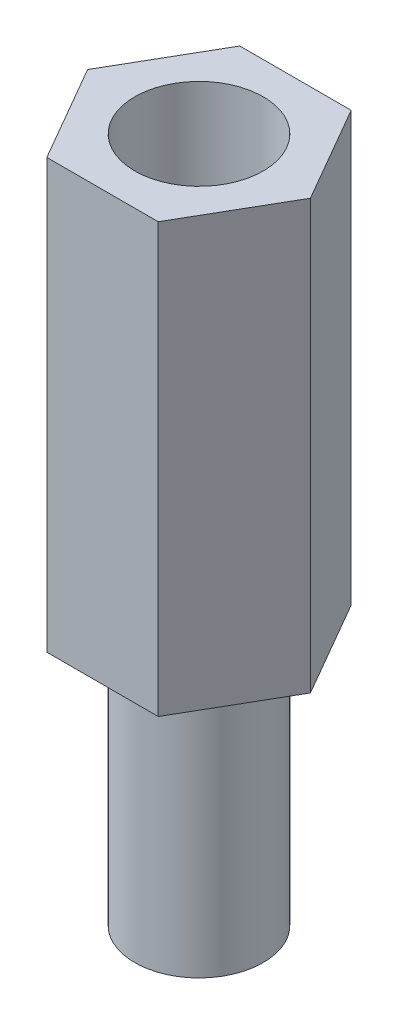
ISO-10303-21;
HEADER;
FILE_DESCRIPTION(('STEP AP214'),'2;1');
FILE_NAME('part.step','',(''),(''),'','','');
FILE_SCHEMA(('AUTOMOTIVE_DESIGN { 1 0 10303 214 1 1 1 1 }'));
ENDSEC;
DATA;
#1=APPLICATION_CONTEXT('core data for automotive mechanical design processes');
#2=APPLICATION_PROTOCOL_DEFINITION('international standard','automotive_design',2000,#1);
#3=PRODUCT_CONTEXT('',#1,'mechanical');
#4=PRODUCT('Part','Part','',(#3));
#5=PRODUCT_RELATED_PRODUCT_CATEGORY('part','',(#4));
#6=PRODUCT_DEFINITION_FORMATION('','',#4);
#7=PRODUCT_DEFINITION_CONTEXT('part definition',#1,'design');
#8=PRODUCT_DEFINITION('design','',#6,#7);
#9=PRODUCT_DEFINITION_SHAPE('','',#8);
#10=(LENGTH_UNIT() NAMED_UNIT(*) SI_UNIT(.MILLI.,.METRE.));
#11=(NAMED_UNIT(*) PLANE_ANGLE_UNIT() SI_UNIT($,.RADIAN.));
#12=(NAMED_UNIT(*) SI_UNIT($,.STERADIAN.) SOLID_ANGLE_UNIT());
#13=UNCERTAINTY_MEASURE_WITH_UNIT(LENGTH_MEASURE(1.E-05),#10,'distance_accuracy_value','');
#14=(GEOMETRIC_REPRESENTATION_CONTEXT(3) GLOBAL_UNCERTAINTY_ASSIGNED_CONTEXT((#13)) GLOBAL_UNIT_ASSIGNED_CONTEXT((#10,
#11,#12)) REPRESENTATION_CONTEXT('',''));
#15=CARTESIAN_POINT('',(0.,0.,0.));
#16=DIRECTION('',(0.,0.,1.));
#17=DIRECTION('',(1.,0.,0.));
#18=AXIS2_PLACEMENT_3D('',#15,#16,#17);
#19=CARTESIAN_POINT('',(1.3,10.,2.25166604983954));
#20=DIRECTION('',(-0.866025403784439,0.,-0.5));
#21=DIRECTION('',(-0.5,0.,0.866025403784439));
#22=AXIS2_PLACEMENT_3D('',#19,#20,#21);
#23=PLANE('',#22);
#24=DIRECTION('',(0.5,0.,-0.866025403784439));
#25=VECTOR('',#24,1.);
#26=CARTESIAN_POINT('',(1.3,0.,2.25166604983954));
#27=LINE('',#26,#25);
#28=CARTESIAN_POINT('',(1.3,0.,2.25166604983954));
#29=VERTEX_POINT('',#28);
#30=CARTESIAN_POINT('',(2.6,0.,0.));
#31=VERTEX_POINT('',#30);
#32=EDGE_CURVE('E131',#29,#31,#27,.T.);
#33=ORIENTED_EDGE('',*,*,#32,.T.);
#34=DIRECTION('',(0.,-1.,0.));
#35=VECTOR('',#34,1.);
#36=CARTESIAN_POINT('',(2.6,10.,0.));
#37=LINE('',#36,#35);
#38=CARTESIAN_POINT('',(2.6,10.,0.));
#39=VERTEX_POINT('',#38);
#40=EDGE_CURVE('E48',#39,#31,#37,.T.);
#41=ORIENTED_EDGE('',*,*,#40,.F.);
#42=DIRECTION('',(0.5,0.,-0.866025403784439));
#43=VECTOR('',#42,1.);
#44=CARTESIAN_POINT('',(1.3,10.,2.25166604983954));
#45=LINE('',#44,#43);
#46=CARTESIAN_POINT('',(1.3,10.,2.25166604983954));
#47=VERTEX_POINT('',#46);
#48=EDGE_CURVE('E142',#47,#39,#45,.T.);
#49=ORIENTED_EDGE('',*,*,#48,.F.);
#50=DIRECTION('',(0.,-1.,0.));
#51=VECTOR('',#50,1.);
#52=CARTESIAN_POINT('',(1.3,10.,2.25166604983954));
#53=LINE('',#52,#51);
#54=EDGE_CURVE('E127',#47,#29,#53,.T.);
#55=ORIENTED_EDGE('',*,*,#54,.T.);
#56=EDGE_LOOP('',(#33,#41,#49,#55));
#57=FACE_BOUND('',#56,.T.);
#58=ADVANCED_FACE('F45',(#57),#23,.F.);
#59=CARTESIAN_POINT('',(2.6,10.,0.));
#60=DIRECTION('',(-0.866025403784439,0.,0.5));
#61=DIRECTION('',(0.5,0.,0.866025403784439));
#62=AXIS2_PLACEMENT_3D('',#59,#60,#61);
#63=PLANE('',#62);
#64=DIRECTION('',(-0.5,0.,-0.866025403784439));
#65=VECTOR('',#64,1.);
#66=CARTESIAN_POINT('',(2.6,0.,0.));
#67=LINE('',#66,#65);
#68=CARTESIAN_POINT('',(1.3,0.,-2.25166604983954));
#69=VERTEX_POINT('',#68);
#70=EDGE_CURVE('E134',#31,#69,#67,.T.);
#71=ORIENTED_EDGE('',*,*,#70,.T.);
#72=DIRECTION('',(0.,-1.,0.));
#73=VECTOR('',#72,1.);
#74=CARTESIAN_POINT('',(1.3,10.,-2.25166604983954));
#75=LINE('',#74,#73);
#76=CARTESIAN_POINT('',(1.3,10.,-2.25166604983954));
#77=VERTEX_POINT('',#76);
#78=EDGE_CURVE('E145',#77,#69,#75,.T.);
#79=ORIENTED_EDGE('',*,*,#78,.F.);
#80=DIRECTION('',(-0.5,0.,-0.866025403784439));
#81=VECTOR('',#80,1.);
#82=CARTESIAN_POINT('',(2.6,10.,0.));
#83=LINE('',#82,#81);
#84=EDGE_CURVE('E100',#39,#77,#83,.T.);
#85=ORIENTED_EDGE('',*,*,#84,.F.);
#86=ORIENTED_EDGE('',*,*,#40,.T.);
#87=EDGE_LOOP('',(#71,#79,#85,#86));
#88=FACE_BOUND('',#87,.T.);
#89=ADVANCED_FACE('F150',(#88),#63,.F.);
#90=CARTESIAN_POINT('',(1.3,10.,-2.25166604983954));
#91=DIRECTION('',(0.,0.,1.));
#92=DIRECTION('',(1.,0.,0.));
#93=AXIS2_PLACEMENT_3D('',#90,#91,#92);
#94=PLANE('',#93);
#95=DIRECTION('',(-1.,0.,0.));
#96=VECTOR('',#95,1.);
#97=CARTESIAN_POINT('',(1.3,0.,-2.25166604983954));
#98=LINE('',#97,#96);
#99=CARTESIAN_POINT('',(-1.3,0.,-2.25166604983954));
#100=VERTEX_POINT('',#99);
#101=EDGE_CURVE('E137',#69,#100,#98,.T.);
#102=ORIENTED_EDGE('',*,*,#101,.T.);
#103=DIRECTION('',(0.,-1.,0.));
#104=VECTOR('',#103,1.);
#105=CARTESIAN_POINT('',(-1.3,10.,-2.25166604983954));
#106=LINE('',#105,#104);
#107=CARTESIAN_POINT('',(-1.3,10.,-2.25166604983954));
#108=VERTEX_POINT('',#107);
#109=EDGE_CURVE('E122',#108,#100,#106,.T.);
#110=ORIENTED_EDGE('',*,*,#109,.F.);
#111=DIRECTION('',(-1.,0.,0.));
#112=VECTOR('',#111,1.);
#113=CARTESIAN_POINT('',(1.3,10.,-2.25166604983954));
#114=LINE('',#113,#112);
#115=EDGE_CURVE('E113',#77,#108,#114,.T.);
#116=ORIENTED_EDGE('',*,*,#115,.F.);
#117=ORIENTED_EDGE('',*,*,#78,.T.);
#118=EDGE_LOOP('',(#102,#110,#116,#117));
#119=FACE_BOUND('',#118,.T.);
#120=ADVANCED_FACE('F156',(#119),#94,.F.);
#121=CARTESIAN_POINT('',(-1.3,10.,-2.25166604983954));
#122=DIRECTION('',(0.866025403784439,0.,0.5));
#123=DIRECTION('',(0.5,0.,-0.866025403784439));
#124=AXIS2_PLACEMENT_3D('',#121,#122,#123);
#125=PLANE('',#124);
#126=DIRECTION('',(-0.5,0.,0.866025403784439));
#127=VECTOR('',#126,1.);
#128=CARTESIAN_POINT('',(-1.3,0.,-2.25166604983954));
#129=LINE('',#128,#127);
#130=CARTESIAN_POINT('',(-2.6,0.,0.));
#131=VERTEX_POINT('',#130);
#132=EDGE_CURVE('E121',#100,#131,#129,.T.);
#133=ORIENTED_EDGE('',*,*,#132,.T.);
#134=DIRECTION('',(0.,-1.,0.));
#135=VECTOR('',#134,1.);
#136=CARTESIAN_POINT('',(-2.6,10.,0.));
#137=LINE('',#136,#135);
#138=CARTESIAN_POINT('',(-2.6,10.,0.));
#139=VERTEX_POINT('',#138);
#140=EDGE_CURVE('E118',#139,#131,#137,.T.);
#141=ORIENTED_EDGE('',*,*,#140,.F.);
#142=DIRECTION('',(-0.5,0.,0.866025403784439));
#143=VECTOR('',#142,1.);
#144=CARTESIAN_POINT('',(-1.3,10.,-2.25166604983954));
#145=LINE('',#144,#143);
#146=EDGE_CURVE('E107',#108,#139,#145,.T.);
#147=ORIENTED_EDGE('',*,*,#146,.F.);
#148=ORIENTED_EDGE('',*,*,#109,.T.);
#149=EDGE_LOOP('',(#133,#141,#147,#148));
#150=FACE_BOUND('',#149,.T.);
#151=ADVANCED_FACE('F119',(#150),#125,.F.);
#152=CARTESIAN_POINT('',(-2.6,10.,0.));
#153=DIRECTION('',(0.866025403784439,0.,-0.5));
#154=DIRECTION('',(-0.5,0.,-0.866025403784439));
#155=AXIS2_PLACEMENT_3D('',#152,#153,#154);
#156=PLANE('',#155);
#157=DIRECTION('',(0.5,0.,0.866025403784439));
#158=VECTOR('',#157,1.);
#159=CARTESIAN_POINT('',(-2.6,0.,0.));
#160=LINE('',#159,#158);
#161=CARTESIAN_POINT('',(-1.3,0.,2.25166604983954));
#162=VERTEX_POINT('',#161);
#163=EDGE_CURVE('E85',#131,#162,#160,.T.);
#164=ORIENTED_EDGE('',*,*,#163,.T.);
#165=DIRECTION('',(0.,-1.,0.));
#166=VECTOR('',#165,1.);
#167=CARTESIAN_POINT('',(-1.3,10.,2.25166604983954));
#168=LINE('',#167,#166);
#169=CARTESIAN_POINT('',(-1.3,10.,2.25166604983954));
#170=VERTEX_POINT('',#169);
#171=EDGE_CURVE('E123',#170,#162,#168,.T.);
#172=ORIENTED_EDGE('',*,*,#171,.F.);
#173=DIRECTION('',(0.5,0.,0.866025403784439));
#174=VECTOR('',#173,1.);
#175=CARTESIAN_POINT('',(-2.6,10.,0.));
#176=LINE('',#175,#174);
#177=EDGE_CURVE('E111',#139,#170,#176,.T.);
#178=ORIENTED_EDGE('',*,*,#177,.F.);
#179=ORIENTED_EDGE('',*,*,#140,.T.);
#180=EDGE_LOOP('',(#164,#172,#178,#179));
#181=FACE_BOUND('',#180,.T.);
#182=ADVANCED_FACE('F125',(#181),#156,.F.);
#183=CARTESIAN_POINT('',(-1.3,10.,2.25166604983954));
#184=DIRECTION('',(0.,0.,-1.));
#185=DIRECTION('',(-1.,0.,0.));
#186=AXIS2_PLACEMENT_3D('',#183,#184,#185);
#187=PLANE('',#186);
#188=DIRECTION('',(1.,0.,0.));
#189=VECTOR('',#188,1.);
#190=CARTESIAN_POINT('',(-1.3,0.,2.25166604983954));
#191=LINE('',#190,#189);
#192=EDGE_CURVE('E91',#162,#29,#191,.T.);
#193=ORIENTED_EDGE('',*,*,#192,.T.);
#194=ORIENTED_EDGE('',*,*,#54,.F.);
#195=DIRECTION('',(1.,0.,0.));
#196=VECTOR('',#195,1.);
#197=CARTESIAN_POINT('',(-1.3,10.,2.25166604983954));
#198=LINE('',#197,#196);
#199=EDGE_CURVE('E62',#170,#47,#198,.T.);
#200=ORIENTED_EDGE('',*,*,#199,.F.);
#201=ORIENTED_EDGE('',*,*,#171,.T.);
#202=EDGE_LOOP('',(#193,#194,#200,#201));
#203=FACE_BOUND('',#202,.T.);
#204=ADVANCED_FACE('F188',(#203),#187,.F.);
#205=CARTESIAN_POINT('',(0.,10.,0.));
#206=DIRECTION('',(0.,1.,0.));
#207=DIRECTION('',(0.,0.,1.));
#208=AXIS2_PLACEMENT_3D('',#205,#206,#207);
#209=PLANE('',#208);
#210=CARTESIAN_POINT('',(0.,10.,0.));
#211=DIRECTION('',(0.,1.,0.));
#212=DIRECTION('',(0.,0.,1.));
#213=AXIS2_PLACEMENT_3D('',#210,#211,#212);
#214=CIRCLE('',#213,1.5);
#215=CARTESIAN_POINT('',(0.,10.,1.5));
#216=VERTEX_POINT('',#215);
#217=EDGE_CURVE('E160',#216,#216,#214,.T.);
#218=ORIENTED_EDGE('',*,*,#217,.F.);
#219=EDGE_LOOP('',(#218));
#220=FACE_BOUND('',#219,.T.);
#221=ORIENTED_EDGE('',*,*,#48,.T.);
#222=ORIENTED_EDGE('',*,*,#84,.T.);
#223=ORIENTED_EDGE('',*,*,#115,.T.);
#224=ORIENTED_EDGE('',*,*,#146,.T.);
#225=ORIENTED_EDGE('',*,*,#177,.T.);
#226=ORIENTED_EDGE('',*,*,#199,.T.);
#227=EDGE_LOOP('',(#221,#222,#223,#224,#225,#226));
#228=FACE_BOUND('',#227,.T.);
#229=ADVANCED_FACE('F109',(#220,#228),#209,.T.);
#230=CARTESIAN_POINT('',(0.,0.,0.));
#231=DIRECTION('',(0.,1.,0.));
#232=DIRECTION('',(0.,0.,1.));
#233=AXIS2_PLACEMENT_3D('',#230,#231,#232);
#234=PLANE('',#233);
#235=CARTESIAN_POINT('',(0.,0.,0.));
#236=DIRECTION('',(0.,-1.,0.));
#237=DIRECTION('',(0.,0.,-1.));
#238=AXIS2_PLACEMENT_3D('',#235,#236,#237);
#239=CIRCLE('',#238,1.5);
#240=CARTESIAN_POINT('',(0.,0.,-1.5));
#241=VERTEX_POINT('',#240);
#242=EDGE_CURVE('E11',#241,#241,#239,.T.);
#243=ORIENTED_EDGE('',*,*,#242,.F.);
#244=EDGE_LOOP('',(#243));
#245=FACE_BOUND('',#244,.T.);
#246=ORIENTED_EDGE('',*,*,#32,.F.);
#247=ORIENTED_EDGE('',*,*,#192,.F.);
#248=ORIENTED_EDGE('',*,*,#163,.F.);
#249=ORIENTED_EDGE('',*,*,#132,.F.);
#250=ORIENTED_EDGE('',*,*,#101,.F.);
#251=ORIENTED_EDGE('',*,*,#70,.F.);
#252=EDGE_LOOP('',(#246,#247,#248,#249,#250,#251));
#253=FACE_BOUND('',#252,.T.);
#254=ADVANCED_FACE('F155',(#245,#253),#234,.F.);
#255=CARTESIAN_POINT('',(0.,3.,0.));
#256=DIRECTION('',(0.,1.,0.));
#257=DIRECTION('',(0.,0.,1.));
#258=AXIS2_PLACEMENT_3D('',#255,#256,#257);
#259=CYLINDRICAL_SURFACE('',#258,1.5);
#260=CARTESIAN_POINT('',(0.,3.,0.));
#261=DIRECTION('',(0.,1.,0.));
#262=DIRECTION('',(0.,0.,1.));
#263=AXIS2_PLACEMENT_3D('',#260,#261,#262);
#264=CIRCLE('',#263,1.5);
#265=CARTESIAN_POINT('',(0.,3.,1.5));
#266=VERTEX_POINT('',#265);
#267=EDGE_CURVE('E135',#266,#266,#264,.T.);
#268=ORIENTED_EDGE('',*,*,#267,.F.);
#269=EDGE_LOOP('',(#268));
#270=FACE_BOUND('',#269,.T.);
#271=ORIENTED_EDGE('',*,*,#217,.T.);
#272=EDGE_LOOP('',(#271));
#273=FACE_BOUND('',#272,.T.);
#274=ADVANCED_FACE('F179',(#270,#273),#259,.F.);
#275=CARTESIAN_POINT('',(0.,3.,0.));
#276=DIRECTION('',(0.,1.,0.));
#277=DIRECTION('',(0.,0.,1.));
#278=AXIS2_PLACEMENT_3D('',#275,#276,#277);
#279=PLANE('',#278);
#280=ORIENTED_EDGE('',*,*,#267,.T.);
#281=EDGE_LOOP('',(#280));
#282=FACE_BOUND('',#281,.T.);
#283=ADVANCED_FACE('F174',(#282),#279,.T.);
#284=CARTESIAN_POINT('',(0.,-6.,0.));
#285=DIRECTION('',(0.,1.,0.));
#286=DIRECTION('',(0.,0.,1.));
#287=AXIS2_PLACEMENT_3D('',#284,#285,#286);
#288=CYLINDRICAL_SURFACE('',#287,1.5);
#289=CARTESIAN_POINT('',(0.,-6.,0.));
#290=DIRECTION('',(0.,-1.,0.));
#291=DIRECTION('',(0.,0.,-1.));
#292=AXIS2_PLACEMENT_3D('',#289,#290,#291);
#293=CIRCLE('',#292,1.5);
#294=CARTESIAN_POINT('',(0.,-6.,-1.5));
#295=VERTEX_POINT('',#294);
#296=EDGE_CURVE('E163',#295,#295,#293,.T.);
#297=ORIENTED_EDGE('',*,*,#296,.F.);
#298=EDGE_LOOP('',(#297));
#299=FACE_BOUND('',#298,.T.);
#300=ORIENTED_EDGE('',*,*,#242,.T.);
#301=EDGE_LOOP('',(#300));
#302=FACE_BOUND('',#301,.T.);
#303=ADVANCED_FACE('F171',(#299,#302),#288,.T.);
#304=CARTESIAN_POINT('',(0.,-6.,0.));
#305=DIRECTION('',(0.,-1.,0.));
#306=DIRECTION('',(0.,0.,-1.));
#307=AXIS2_PLACEMENT_3D('',#304,#305,#306);
#308=PLANE('',#307);
#309=ORIENTED_EDGE('',*,*,#296,.T.);
#310=EDGE_LOOP('',(#309));
#311=FACE_BOUND('',#310,.T.);
#312=ADVANCED_FACE('F169',(#311),#308,.T.);
#313=CLOSED_SHELL('',(#58,#89,#120,#151,#182,#204,#229,#254,#274,#283,#303,#312));
#314=MANIFOLD_SOLID_BREP('B2',#313);
#315=ADVANCED_BREP_SHAPE_REPRESENTATION('',(#18,#314),#14);
#316=SHAPE_DEFINITION_REPRESENTATION(#9,#315);
ENDSEC;
END-ISO-10303-21;
